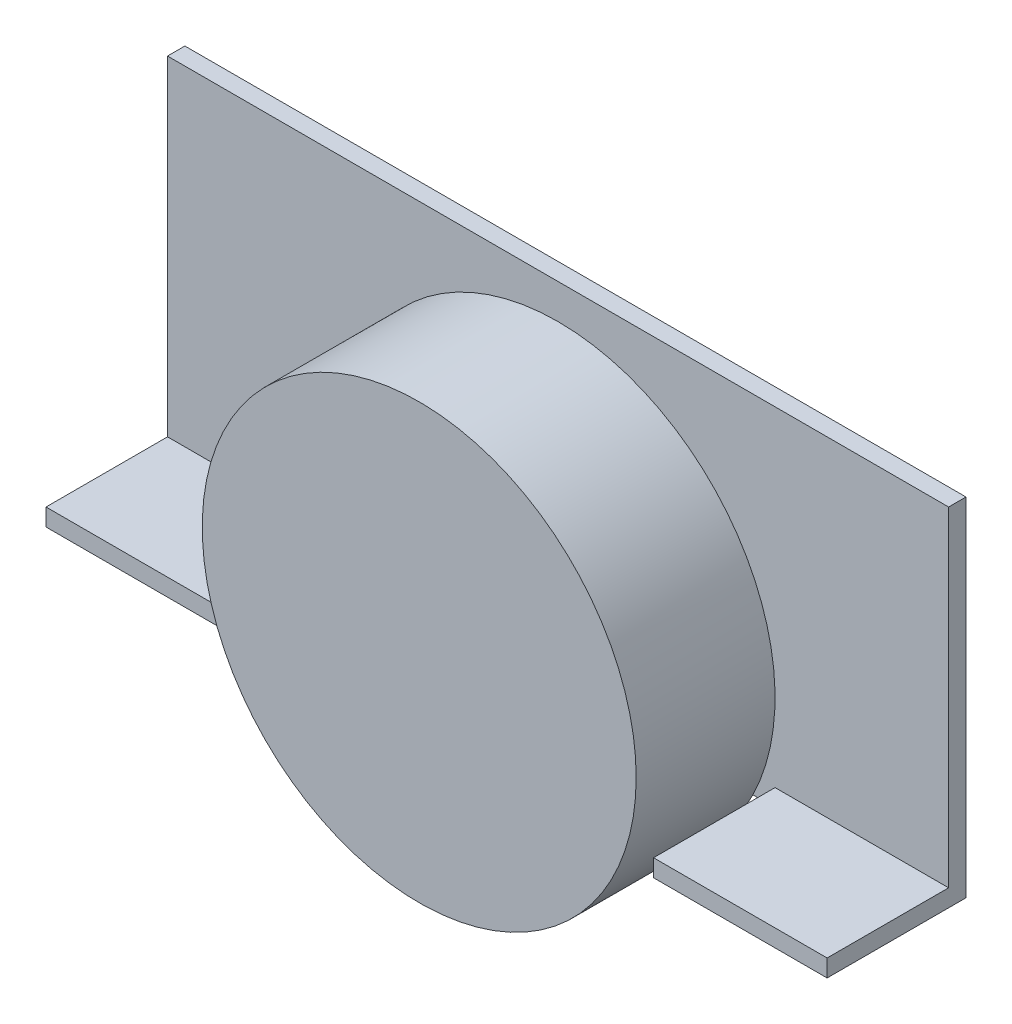
ISO-10303-21;
HEADER;
FILE_DESCRIPTION(('STEP AP214'),'2;1');
FILE_NAME('part.step','',(''),(''),'','','');
FILE_SCHEMA(('AUTOMOTIVE_DESIGN { 1 0 10303 214 1 1 1 1 }'));
ENDSEC;
DATA;
#1=APPLICATION_CONTEXT('core data for automotive mechanical design processes');
#2=APPLICATION_PROTOCOL_DEFINITION('international standard','automotive_design',2000,#1);
#3=PRODUCT_CONTEXT('',#1,'mechanical');
#4=PRODUCT('Part','Part','',(#3));
#5=PRODUCT_RELATED_PRODUCT_CATEGORY('part','',(#4));
#6=PRODUCT_DEFINITION_FORMATION('','',#4);
#7=PRODUCT_DEFINITION_CONTEXT('part definition',#1,'design');
#8=PRODUCT_DEFINITION('design','',#6,#7);
#9=PRODUCT_DEFINITION_SHAPE('','',#8);
#10=(LENGTH_UNIT() NAMED_UNIT(*) SI_UNIT(.MILLI.,.METRE.));
#11=(NAMED_UNIT(*) PLANE_ANGLE_UNIT() SI_UNIT($,.RADIAN.));
#12=(NAMED_UNIT(*) SI_UNIT($,.STERADIAN.) SOLID_ANGLE_UNIT());
#13=UNCERTAINTY_MEASURE_WITH_UNIT(LENGTH_MEASURE(1.E-05),#10,'distance_accuracy_value','');
#14=(GEOMETRIC_REPRESENTATION_CONTEXT(3) GLOBAL_UNCERTAINTY_ASSIGNED_CONTEXT((#13)) GLOBAL_UNIT_ASSIGNED_CONTEXT((#10,
#11,#12)) REPRESENTATION_CONTEXT('',''));
#15=CARTESIAN_POINT('',(0.,0.,0.));
#16=DIRECTION('',(0.,0.,1.));
#17=DIRECTION('',(1.,0.,0.));
#18=AXIS2_PLACEMENT_3D('',#15,#16,#17);
#19=CARTESIAN_POINT('',(0.,0.,1.));
#20=DIRECTION('',(0.,0.,-1.));
#21=DIRECTION('',(-1.,0.,0.));
#22=AXIS2_PLACEMENT_3D('',#19,#20,#21);
#23=PLANE('',#22);
#24=DIRECTION('',(-1.,0.,0.));
#25=VECTOR('',#24,1.);
#26=CARTESIAN_POINT('',(45.,1.,1.));
#27=LINE('',#26,#25);
#28=CARTESIAN_POINT('',(45.,1.,1.));
#29=VERTEX_POINT('',#28);
#30=CARTESIAN_POINT('',(35.,0.999999999999999,1.));
#31=VERTEX_POINT('',#30);
#32=EDGE_CURVE('E132',#29,#31,#27,.T.);
#33=ORIENTED_EDGE('',*,*,#32,.F.);
#34=DIRECTION('',(0.,1.,0.));
#35=VECTOR('',#34,1.);
#36=CARTESIAN_POINT('',(45.,0.,1.));
#37=LINE('',#36,#35);
#38=CARTESIAN_POINT('',(45.,20.,1.));
#39=VERTEX_POINT('',#38);
#40=EDGE_CURVE('E121',#29,#39,#37,.T.);
#41=ORIENTED_EDGE('',*,*,#40,.T.);
#42=DIRECTION('',(-1.,0.,0.));
#43=VECTOR('',#42,1.);
#44=CARTESIAN_POINT('',(0.,20.,1.));
#45=LINE('',#44,#43);
#46=CARTESIAN_POINT('',(0.,20.,1.));
#47=VERTEX_POINT('',#46);
#48=EDGE_CURVE('E129',#39,#47,#45,.T.);
#49=ORIENTED_EDGE('',*,*,#48,.T.);
#50=DIRECTION('',(0.,-1.,0.));
#51=VECTOR('',#50,1.);
#52=CARTESIAN_POINT('',(0.,0.,1.));
#53=LINE('',#52,#51);
#54=CARTESIAN_POINT('',(0.,1.,1.));
#55=VERTEX_POINT('',#54);
#56=EDGE_CURVE('E185',#47,#55,#53,.T.);
#57=ORIENTED_EDGE('',*,*,#56,.T.);
#58=DIRECTION('',(-1.,0.,0.));
#59=VECTOR('',#58,1.);
#60=CARTESIAN_POINT('',(0.,1.,1.));
#61=LINE('',#60,#59);
#62=CARTESIAN_POINT('',(10.,1.,1.));
#63=VERTEX_POINT('',#62);
#64=EDGE_CURVE('E161',#63,#55,#61,.T.);
#65=ORIENTED_EDGE('',*,*,#64,.F.);
#66=DIRECTION('',(0.,1.,0.));
#67=VECTOR('',#66,1.);
#68=CARTESIAN_POINT('',(10.,0.,1.));
#69=LINE('',#68,#67);
#70=CARTESIAN_POINT('',(10.,0.,1.));
#71=VERTEX_POINT('',#70);
#72=EDGE_CURVE('E136',#71,#63,#69,.T.);
#73=ORIENTED_EDGE('',*,*,#72,.F.);
#74=DIRECTION('',(1.,0.,0.));
#75=VECTOR('',#74,1.);
#76=CARTESIAN_POINT('',(0.,0.,1.));
#77=LINE('',#76,#75);
#78=CARTESIAN_POINT('',(11.2750278396782,0.,1.));
#79=VERTEX_POINT('',#78);
#80=EDGE_CURVE('E130',#71,#79,#77,.T.);
#81=ORIENTED_EDGE('',*,*,#80,.T.);
#82=CARTESIAN_POINT('',(22.5,5.5,1.));
#83=DIRECTION('',(0.,0.,1.));
#84=DIRECTION('',(1.,0.,0.));
#85=AXIS2_PLACEMENT_3D('',#82,#83,#84);
#86=CIRCLE('',#85,12.5);
#87=CARTESIAN_POINT('',(33.7249721603218,0.,1.));
#88=VERTEX_POINT('',#87);
#89=EDGE_CURVE('E11',#88,#79,#86,.T.);
#90=ORIENTED_EDGE('',*,*,#89,.F.);
#91=CARTESIAN_POINT('',(35.,0.,1.));
#92=VERTEX_POINT('',#91);
#93=EDGE_CURVE('E59',#88,#92,#77,.T.);
#94=ORIENTED_EDGE('',*,*,#93,.T.);
#95=DIRECTION('',(0.,-1.,0.));
#96=VECTOR('',#95,1.);
#97=CARTESIAN_POINT('',(35.,0.,1.));
#98=LINE('',#97,#96);
#99=EDGE_CURVE('E54',#31,#92,#98,.T.);
#100=ORIENTED_EDGE('',*,*,#99,.F.);
#101=EDGE_LOOP('',(#33,#41,#49,#57,#65,#73,#81,#90,#94,#100));
#102=FACE_BOUND('',#101,.T.);
#103=ADVANCED_FACE('F37',(#102),#23,.F.);
#104=CARTESIAN_POINT('',(0.,0.,1.));
#105=DIRECTION('',(1.,0.,0.));
#106=DIRECTION('',(0.,0.,-1.));
#107=AXIS2_PLACEMENT_3D('',#104,#105,#106);
#108=PLANE('',#107);
#109=DIRECTION('',(0.,-1.,0.));
#110=VECTOR('',#109,1.);
#111=CARTESIAN_POINT('',(0.,0.,0.));
#112=LINE('',#111,#110);
#113=CARTESIAN_POINT('',(0.,20.,0.));
#114=VERTEX_POINT('',#113);
#115=CARTESIAN_POINT('',(0.,0.,0.));
#116=VERTEX_POINT('',#115);
#117=EDGE_CURVE('E182',#114,#116,#112,.T.);
#118=ORIENTED_EDGE('',*,*,#117,.T.);
#119=DIRECTION('',(0.,0.,-1.));
#120=VECTOR('',#119,1.);
#121=CARTESIAN_POINT('',(0.,0.,1.));
#122=LINE('',#121,#120);
#123=CARTESIAN_POINT('',(0.,0.,8.));
#124=VERTEX_POINT('',#123);
#125=EDGE_CURVE('E41',#124,#116,#122,.T.);
#126=ORIENTED_EDGE('',*,*,#125,.F.);
#127=DIRECTION('',(0.,-1.,0.));
#128=VECTOR('',#127,1.);
#129=CARTESIAN_POINT('',(0.,0.,8.));
#130=LINE('',#129,#128);
#131=CARTESIAN_POINT('',(0.,1.,8.));
#132=VERTEX_POINT('',#131);
#133=EDGE_CURVE('E157',#132,#124,#130,.T.);
#134=ORIENTED_EDGE('',*,*,#133,.F.);
#135=DIRECTION('',(0.,0.,-1.));
#136=VECTOR('',#135,1.);
#137=CARTESIAN_POINT('',(0.,1.,8.));
#138=LINE('',#137,#136);
#139=EDGE_CURVE('E167',#132,#55,#138,.T.);
#140=ORIENTED_EDGE('',*,*,#139,.T.);
#141=ORIENTED_EDGE('',*,*,#56,.F.);
#142=DIRECTION('',(0.,0.,-1.));
#143=VECTOR('',#142,1.);
#144=CARTESIAN_POINT('',(0.,20.,1.));
#145=LINE('',#144,#143);
#146=EDGE_CURVE('E191',#47,#114,#145,.T.);
#147=ORIENTED_EDGE('',*,*,#146,.T.);
#148=EDGE_LOOP('',(#118,#126,#134,#140,#141,#147));
#149=FACE_BOUND('',#148,.T.);
#150=ADVANCED_FACE('F39',(#149),#108,.F.);
#151=CARTESIAN_POINT('',(0.,0.,1.));
#152=DIRECTION('',(0.,1.,0.));
#153=DIRECTION('',(0.,0.,1.));
#154=AXIS2_PLACEMENT_3D('',#151,#152,#153);
#155=PLANE('',#154);
#156=DIRECTION('',(1.,0.,0.));
#157=VECTOR('',#156,1.);
#158=CARTESIAN_POINT('',(0.,0.,0.));
#159=LINE('',#158,#157);
#160=CARTESIAN_POINT('',(45.,0.,0.));
#161=VERTEX_POINT('',#160);
#162=EDGE_CURVE('E194',#116,#161,#159,.T.);
#163=ORIENTED_EDGE('',*,*,#162,.T.);
#164=DIRECTION('',(0.,0.,-1.));
#165=VECTOR('',#164,1.);
#166=CARTESIAN_POINT('',(45.,0.,1.));
#167=LINE('',#166,#165);
#168=CARTESIAN_POINT('',(45.,0.,8.));
#169=VERTEX_POINT('',#168);
#170=EDGE_CURVE('E201',#169,#161,#167,.T.);
#171=ORIENTED_EDGE('',*,*,#170,.F.);
#172=DIRECTION('',(1.,0.,0.));
#173=VECTOR('',#172,1.);
#174=CARTESIAN_POINT('',(45.,0.,8.));
#175=LINE('',#174,#173);
#176=CARTESIAN_POINT('',(35.,0.,8.));
#177=VERTEX_POINT('',#176);
#178=EDGE_CURVE('E148',#177,#169,#175,.T.);
#179=ORIENTED_EDGE('',*,*,#178,.F.);
#180=DIRECTION('',(0.,0.,-1.));
#181=VECTOR('',#180,1.);
#182=CARTESIAN_POINT('',(35.,0.,8.));
#183=LINE('',#182,#181);
#184=EDGE_CURVE('E143',#177,#92,#183,.T.);
#185=ORIENTED_EDGE('',*,*,#184,.T.);
#186=ORIENTED_EDGE('',*,*,#93,.F.);
#187=EDGE_CURVE('E188',#79,#88,#77,.T.);
#188=ORIENTED_EDGE('',*,*,#187,.F.);
#189=ORIENTED_EDGE('',*,*,#80,.F.);
#190=DIRECTION('',(0.,0.,-1.));
#191=VECTOR('',#190,1.);
#192=CARTESIAN_POINT('',(10.,0.,8.));
#193=LINE('',#192,#191);
#194=CARTESIAN_POINT('',(10.,0.,8.));
#195=VERTEX_POINT('',#194);
#196=EDGE_CURVE('E177',#195,#71,#193,.T.);
#197=ORIENTED_EDGE('',*,*,#196,.F.);
#198=DIRECTION('',(1.,0.,0.));
#199=VECTOR('',#198,1.);
#200=CARTESIAN_POINT('',(0.,0.,8.));
#201=LINE('',#200,#199);
#202=EDGE_CURVE('E160',#124,#195,#201,.T.);
#203=ORIENTED_EDGE('',*,*,#202,.F.);
#204=ORIENTED_EDGE('',*,*,#125,.T.);
#205=EDGE_LOOP('',(#163,#171,#179,#185,#186,#188,#189,#197,#203,#204));
#206=FACE_BOUND('',#205,.T.);
#207=ADVANCED_FACE('F207',(#206),#155,.F.);
#208=CARTESIAN_POINT('',(45.,0.,1.));
#209=DIRECTION('',(-1.,0.,0.));
#210=DIRECTION('',(0.,0.,1.));
#211=AXIS2_PLACEMENT_3D('',#208,#209,#210);
#212=PLANE('',#211);
#213=DIRECTION('',(0.,1.,0.));
#214=VECTOR('',#213,1.);
#215=CARTESIAN_POINT('',(45.,0.,0.));
#216=LINE('',#215,#214);
#217=CARTESIAN_POINT('',(45.,20.,0.));
#218=VERTEX_POINT('',#217);
#219=EDGE_CURVE('E196',#161,#218,#216,.T.);
#220=ORIENTED_EDGE('',*,*,#219,.T.);
#221=DIRECTION('',(0.,0.,-1.));
#222=VECTOR('',#221,1.);
#223=CARTESIAN_POINT('',(45.,20.,1.));
#224=LINE('',#223,#222);
#225=EDGE_CURVE('E127',#39,#218,#224,.T.);
#226=ORIENTED_EDGE('',*,*,#225,.F.);
#227=ORIENTED_EDGE('',*,*,#40,.F.);
#228=DIRECTION('',(0.,0.,-1.));
#229=VECTOR('',#228,1.);
#230=CARTESIAN_POINT('',(45.,1.,8.));
#231=LINE('',#230,#229);
#232=CARTESIAN_POINT('',(45.,1.,8.));
#233=VERTEX_POINT('',#232);
#234=EDGE_CURVE('E125',#233,#29,#231,.T.);
#235=ORIENTED_EDGE('',*,*,#234,.F.);
#236=DIRECTION('',(0.,1.,0.));
#237=VECTOR('',#236,1.);
#238=CARTESIAN_POINT('',(45.,0.,8.));
#239=LINE('',#238,#237);
#240=EDGE_CURVE('E149',#169,#233,#239,.T.);
#241=ORIENTED_EDGE('',*,*,#240,.F.);
#242=ORIENTED_EDGE('',*,*,#170,.T.);
#243=EDGE_LOOP('',(#220,#226,#227,#235,#241,#242));
#244=FACE_BOUND('',#243,.T.);
#245=ADVANCED_FACE('F122',(#244),#212,.F.);
#246=CARTESIAN_POINT('',(0.,20.,1.));
#247=DIRECTION('',(0.,-1.,0.));
#248=DIRECTION('',(0.,0.,-1.));
#249=AXIS2_PLACEMENT_3D('',#246,#247,#248);
#250=PLANE('',#249);
#251=DIRECTION('',(-1.,0.,0.));
#252=VECTOR('',#251,1.);
#253=CARTESIAN_POINT('',(0.,20.,0.));
#254=LINE('',#253,#252);
#255=EDGE_CURVE('E187',#218,#114,#254,.T.);
#256=ORIENTED_EDGE('',*,*,#255,.T.);
#257=ORIENTED_EDGE('',*,*,#146,.F.);
#258=ORIENTED_EDGE('',*,*,#48,.F.);
#259=ORIENTED_EDGE('',*,*,#225,.T.);
#260=EDGE_LOOP('',(#256,#257,#258,#259));
#261=FACE_BOUND('',#260,.T.);
#262=ADVANCED_FACE('F218',(#261),#250,.F.);
#263=CARTESIAN_POINT('',(0.,0.,0.));
#264=DIRECTION('',(0.,0.,-1.));
#265=DIRECTION('',(-1.,0.,0.));
#266=AXIS2_PLACEMENT_3D('',#263,#264,#265);
#267=PLANE('',#266);
#268=ORIENTED_EDGE('',*,*,#117,.F.);
#269=ORIENTED_EDGE('',*,*,#255,.F.);
#270=ORIENTED_EDGE('',*,*,#219,.F.);
#271=ORIENTED_EDGE('',*,*,#162,.F.);
#272=EDGE_LOOP('',(#268,#269,#270,#271));
#273=FACE_BOUND('',#272,.T.);
#274=ADVANCED_FACE('F216',(#273),#267,.T.);
#275=CARTESIAN_POINT('',(22.5,5.5,1.));
#276=DIRECTION('',(0.,0.,1.));
#277=DIRECTION('',(1.,0.,0.));
#278=AXIS2_PLACEMENT_3D('',#275,#276,#277);
#279=PLANE('',#278);
#280=EDGE_CURVE('E47',#79,#88,#86,.T.);
#281=ORIENTED_EDGE('',*,*,#280,.F.);
#282=ORIENTED_EDGE('',*,*,#187,.T.);
#283=EDGE_LOOP('',(#281,#282));
#284=FACE_BOUND('',#283,.T.);
#285=ADVANCED_FACE('F236',(#284),#279,.F.);
#286=CARTESIAN_POINT('',(22.5,5.5,9.));
#287=DIRECTION('',(0.,0.,-1.));
#288=DIRECTION('',(-1.,0.,0.));
#289=AXIS2_PLACEMENT_3D('',#286,#287,#288);
#290=CYLINDRICAL_SURFACE('',#289,12.5);
#291=CARTESIAN_POINT('',(22.5,5.5,9.));
#292=DIRECTION('',(0.,0.,1.));
#293=DIRECTION('',(1.,0.,0.));
#294=AXIS2_PLACEMENT_3D('',#291,#292,#293);
#295=CIRCLE('',#294,12.5);
#296=CARTESIAN_POINT('',(35.,5.5,9.));
#297=VERTEX_POINT('',#296);
#298=EDGE_CURVE('E180',#297,#297,#295,.T.);
#299=ORIENTED_EDGE('',*,*,#298,.F.);
#300=EDGE_LOOP('',(#299));
#301=FACE_BOUND('',#300,.T.);
#302=ORIENTED_EDGE('',*,*,#280,.T.);
#303=ORIENTED_EDGE('',*,*,#89,.T.);
#304=EDGE_LOOP('',(#302,#303));
#305=FACE_BOUND('',#304,.T.);
#306=ADVANCED_FACE('F235',(#301,#305),#290,.T.);
#307=CARTESIAN_POINT('',(22.5,5.5,9.));
#308=DIRECTION('',(0.,0.,1.));
#309=DIRECTION('',(1.,0.,0.));
#310=AXIS2_PLACEMENT_3D('',#307,#308,#309);
#311=PLANE('',#310);
#312=ORIENTED_EDGE('',*,*,#298,.T.);
#313=EDGE_LOOP('',(#312));
#314=FACE_BOUND('',#313,.T.);
#315=ADVANCED_FACE('F243',(#314),#311,.T.);
#316=CARTESIAN_POINT('',(10.,0.,8.));
#317=DIRECTION('',(-1.,0.,0.));
#318=DIRECTION('',(0.,0.,1.));
#319=AXIS2_PLACEMENT_3D('',#316,#317,#318);
#320=PLANE('',#319);
#321=ORIENTED_EDGE('',*,*,#72,.T.);
#322=DIRECTION('',(0.,0.,-1.));
#323=VECTOR('',#322,1.);
#324=CARTESIAN_POINT('',(10.,1.,8.));
#325=LINE('',#324,#323);
#326=CARTESIAN_POINT('',(10.,1.,8.));
#327=VERTEX_POINT('',#326);
#328=EDGE_CURVE('E174',#327,#63,#325,.T.);
#329=ORIENTED_EDGE('',*,*,#328,.F.);
#330=DIRECTION('',(0.,1.,0.));
#331=VECTOR('',#330,1.);
#332=CARTESIAN_POINT('',(10.,0.,8.));
#333=LINE('',#332,#331);
#334=EDGE_CURVE('E163',#195,#327,#333,.T.);
#335=ORIENTED_EDGE('',*,*,#334,.F.);
#336=ORIENTED_EDGE('',*,*,#196,.T.);
#337=EDGE_LOOP('',(#321,#329,#335,#336));
#338=FACE_BOUND('',#337,.T.);
#339=ADVANCED_FACE('F228',(#338),#320,.F.);
#340=CARTESIAN_POINT('',(0.,1.,8.));
#341=DIRECTION('',(0.,-1.,0.));
#342=DIRECTION('',(0.,0.,-1.));
#343=AXIS2_PLACEMENT_3D('',#340,#341,#342);
#344=PLANE('',#343);
#345=ORIENTED_EDGE('',*,*,#64,.T.);
#346=ORIENTED_EDGE('',*,*,#139,.F.);
#347=DIRECTION('',(-1.,0.,0.));
#348=VECTOR('',#347,1.);
#349=CARTESIAN_POINT('',(0.,1.,8.));
#350=LINE('',#349,#348);
#351=EDGE_CURVE('E165',#327,#132,#350,.T.);
#352=ORIENTED_EDGE('',*,*,#351,.F.);
#353=ORIENTED_EDGE('',*,*,#328,.T.);
#354=EDGE_LOOP('',(#345,#346,#352,#353));
#355=FACE_BOUND('',#354,.T.);
#356=ADVANCED_FACE('F221',(#355),#344,.F.);
#357=CARTESIAN_POINT('',(0.,0.,8.));
#358=DIRECTION('',(0.,0.,-1.));
#359=DIRECTION('',(-1.,0.,0.));
#360=AXIS2_PLACEMENT_3D('',#357,#358,#359);
#361=PLANE('',#360);
#362=ORIENTED_EDGE('',*,*,#133,.T.);
#363=ORIENTED_EDGE('',*,*,#202,.T.);
#364=ORIENTED_EDGE('',*,*,#334,.T.);
#365=ORIENTED_EDGE('',*,*,#351,.T.);
#366=EDGE_LOOP('',(#362,#363,#364,#365));
#367=FACE_BOUND('',#366,.T.);
#368=ADVANCED_FACE('F225',(#367),#361,.F.);
#369=CARTESIAN_POINT('',(45.,1.,8.));
#370=DIRECTION('',(0.,-1.,0.));
#371=DIRECTION('',(1.,0.,0.));
#372=AXIS2_PLACEMENT_3D('',#369,#370,#371);
#373=PLANE('',#372);
#374=ORIENTED_EDGE('',*,*,#32,.T.);
#375=DIRECTION('',(0.,0.,-1.));
#376=VECTOR('',#375,1.);
#377=CARTESIAN_POINT('',(35.,0.999999999999999,8.));
#378=LINE('',#377,#376);
#379=CARTESIAN_POINT('',(35.,0.999999999999999,8.));
#380=VERTEX_POINT('',#379);
#381=EDGE_CURVE('E141',#380,#31,#378,.T.);
#382=ORIENTED_EDGE('',*,*,#381,.F.);
#383=DIRECTION('',(-1.,0.,0.));
#384=VECTOR('',#383,1.);
#385=CARTESIAN_POINT('',(45.,1.,8.));
#386=LINE('',#385,#384);
#387=EDGE_CURVE('E139',#233,#380,#386,.T.);
#388=ORIENTED_EDGE('',*,*,#387,.F.);
#389=ORIENTED_EDGE('',*,*,#234,.T.);
#390=EDGE_LOOP('',(#374,#382,#388,#389));
#391=FACE_BOUND('',#390,.T.);
#392=ADVANCED_FACE('F138',(#391),#373,.F.);
#393=CARTESIAN_POINT('',(35.,0.,8.));
#394=DIRECTION('',(1.,0.,0.));
#395=DIRECTION('',(0.,0.,-1.));
#396=AXIS2_PLACEMENT_3D('',#393,#394,#395);
#397=PLANE('',#396);
#398=ORIENTED_EDGE('',*,*,#99,.T.);
#399=ORIENTED_EDGE('',*,*,#184,.F.);
#400=DIRECTION('',(0.,-1.,0.));
#401=VECTOR('',#400,1.);
#402=CARTESIAN_POINT('',(35.,0.,8.));
#403=LINE('',#402,#401);
#404=EDGE_CURVE('E153',#380,#177,#403,.T.);
#405=ORIENTED_EDGE('',*,*,#404,.F.);
#406=ORIENTED_EDGE('',*,*,#381,.T.);
#407=EDGE_LOOP('',(#398,#399,#405,#406));
#408=FACE_BOUND('',#407,.T.);
#409=ADVANCED_FACE('F362',(#408),#397,.F.);
#410=CARTESIAN_POINT('',(0.,0.,8.));
#411=DIRECTION('',(0.,0.,1.));
#412=DIRECTION('',(1.,0.,0.));
#413=AXIS2_PLACEMENT_3D('',#410,#411,#412);
#414=PLANE('',#413);
#415=ORIENTED_EDGE('',*,*,#240,.T.);
#416=ORIENTED_EDGE('',*,*,#387,.T.);
#417=ORIENTED_EDGE('',*,*,#404,.T.);
#418=ORIENTED_EDGE('',*,*,#178,.T.);
#419=EDGE_LOOP('',(#415,#416,#417,#418));
#420=FACE_BOUND('',#419,.T.);
#421=ADVANCED_FACE('F372',(#420),#414,.T.);
#422=CLOSED_SHELL('',(#103,#150,#207,#245,#262,#274,#285,#306,#315,#339,#356,#368,#392,#409,#421));
#423=MANIFOLD_SOLID_BREP('B2',#422);
#424=ADVANCED_BREP_SHAPE_REPRESENTATION('',(#18,#423),#14);
#425=SHAPE_DEFINITION_REPRESENTATION(#9,#424);
ENDSEC;
END-ISO-10303-21;
